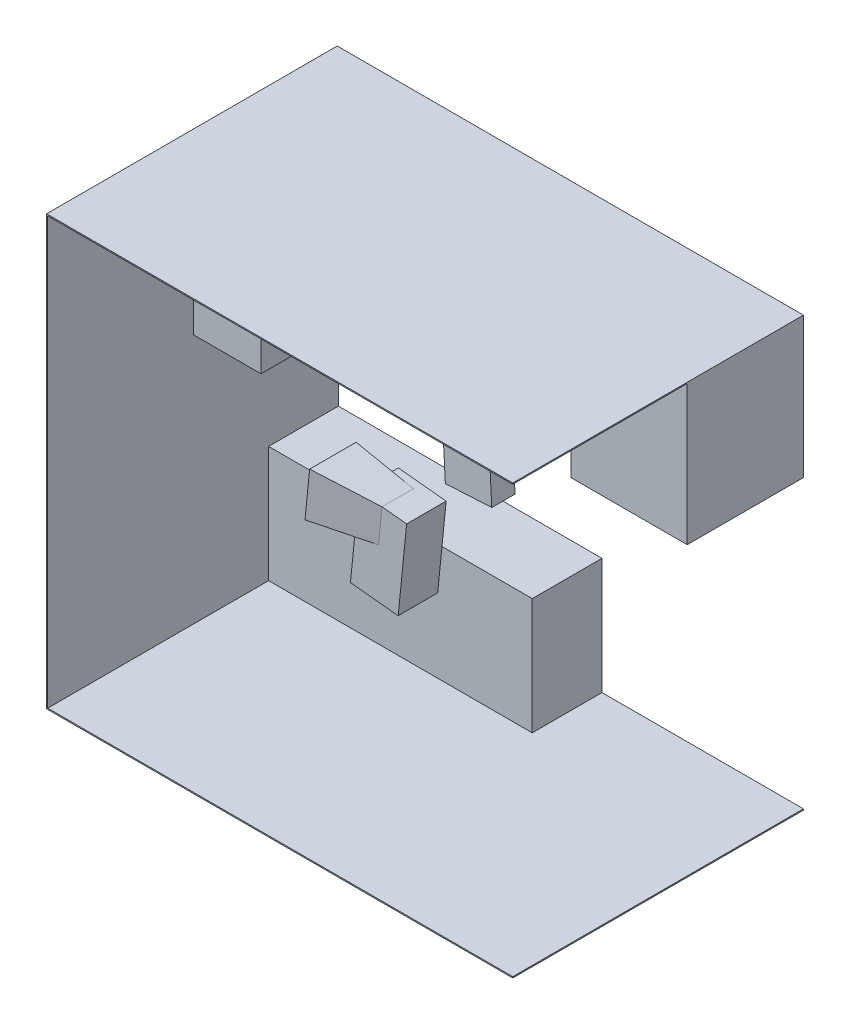
ISO-10303-21;
HEADER;
FILE_DESCRIPTION(('STEP AP214'),'2;1');
FILE_NAME('part.step','',(''),(''),'','','');
FILE_SCHEMA(('AUTOMOTIVE_DESIGN { 1 0 10303 214 1 1 1 1 }'));
ENDSEC;
DATA;
#1=APPLICATION_CONTEXT('core data for automotive mechanical design processes');
#2=APPLICATION_PROTOCOL_DEFINITION('international standard','automotive_design',2000,#1);
#3=PRODUCT_CONTEXT('',#1,'mechanical');
#4=PRODUCT('Part','Part','',(#3));
#5=PRODUCT_RELATED_PRODUCT_CATEGORY('part','',(#4));
#6=PRODUCT_DEFINITION_FORMATION('','',#4);
#7=PRODUCT_DEFINITION_CONTEXT('part definition',#1,'design');
#8=PRODUCT_DEFINITION('design','',#6,#7);
#9=PRODUCT_DEFINITION_SHAPE('','',#8);
#10=(LENGTH_UNIT() NAMED_UNIT(*) SI_UNIT(.MILLI.,.METRE.));
#11=(NAMED_UNIT(*) PLANE_ANGLE_UNIT() SI_UNIT($,.RADIAN.));
#12=(NAMED_UNIT(*) SI_UNIT($,.STERADIAN.) SOLID_ANGLE_UNIT());
#13=UNCERTAINTY_MEASURE_WITH_UNIT(LENGTH_MEASURE(1.E-05),#10,'distance_accuracy_value','');
#14=(GEOMETRIC_REPRESENTATION_CONTEXT(3) GLOBAL_UNCERTAINTY_ASSIGNED_CONTEXT((#13)) GLOBAL_UNIT_ASSIGNED_CONTEXT((#10,
#11,#12)) REPRESENTATION_CONTEXT('',''));
#15=CARTESIAN_POINT('',(0.,0.,0.));
#16=DIRECTION('',(0.,0.,1.));
#17=DIRECTION('',(1.,0.,0.));
#18=AXIS2_PLACEMENT_3D('',#15,#16,#17);
#19=CARTESIAN_POINT('',(1132.48794205898,-728.803884791874,683.9));
#20=DIRECTION('',(-0.100393471643706,-0.994947813129575,0.));
#21=DIRECTION('',(0.994947813129576,-0.100393471643706,0.));
#22=AXIS2_PLACEMENT_3D('',#19,#20,#21);
#23=PLANE('',#22);
#24=DIRECTION('',(0.,0.,1.));
#25=VECTOR('',#24,1.);
#26=CARTESIAN_POINT('',(1543.15265192821,-770.241290212813,683.9));
#27=LINE('',#26,#25);
#28=CARTESIAN_POINT('',(1543.15265192821,-770.241290212813,683.9));
#29=VERTEX_POINT('',#28);
#30=CARTESIAN_POINT('',(1543.15265192821,-770.241290212813,1023.9));
#31=VERTEX_POINT('',#30);
#32=EDGE_CURVE('E398',#29,#31,#27,.T.);
#33=ORIENTED_EDGE('',*,*,#32,.T.);
#34=DIRECTION('',(-0.994947813129576,0.100393471643706,0.));
#35=VECTOR('',#34,1.);
#36=CARTESIAN_POINT('',(-61.3833228855726,-608.338389615358,1023.9));
#37=LINE('',#36,#35);
#38=CARTESIAN_POINT('',(1132.48794205898,-728.803884791874,1023.9));
#39=VERTEX_POINT('',#38);
#40=EDGE_CURVE('E377',#31,#39,#37,.T.);
#41=ORIENTED_EDGE('',*,*,#40,.T.);
#42=DIRECTION('',(0.,0.,1.));
#43=VECTOR('',#42,1.);
#44=CARTESIAN_POINT('',(1132.48794205898,-728.803884791874,683.9));
#45=LINE('',#44,#43);
#46=CARTESIAN_POINT('',(1132.48794205898,-728.803884791874,683.9));
#47=VERTEX_POINT('',#46);
#48=EDGE_CURVE('E183',#47,#39,#45,.T.);
#49=ORIENTED_EDGE('',*,*,#48,.F.);
#50=DIRECTION('',(0.994947813129575,-0.100393471643706,0.));
#51=VECTOR('',#50,1.);
#52=CARTESIAN_POINT('',(1132.48794205898,-728.803884791874,683.9));
#53=LINE('',#52,#51);
#54=EDGE_CURVE('E387',#47,#29,#53,.T.);
#55=ORIENTED_EDGE('',*,*,#54,.T.);
#56=EDGE_LOOP('',(#33,#41,#49,#55));
#57=FACE_BOUND('',#56,.T.);
#58=ADVANCED_FACE('F173',(#57),#23,.T.);
#59=CARTESIAN_POINT('',(1132.48794205898,-728.803884791874,683.9));
#60=DIRECTION('',(0.994947813129575,-0.100393471643706,0.));
#61=DIRECTION('',(0.100393471643706,0.994947813129576,0.));
#62=AXIS2_PLACEMENT_3D('',#59,#60,#61);
#63=PLANE('',#62);
#64=DIRECTION('',(0.,0.,-1.));
#65=VECTOR('',#64,1.);
#66=CARTESIAN_POINT('',(1173.03686525587,-326.944463068838,683.9));
#67=LINE('',#66,#65);
#68=CARTESIAN_POINT('',(1173.03686525587,-326.944463068838,1023.9));
#69=VERTEX_POINT('',#68);
#70=CARTESIAN_POINT('',(1173.03686525587,-326.944463068838,753.9));
#71=VERTEX_POINT('',#70);
#72=EDGE_CURVE('E277',#69,#71,#67,.T.);
#73=ORIENTED_EDGE('',*,*,#72,.T.);
#74=DIRECTION('',(0.100393471643706,0.994947813129576,0.));
#75=VECTOR('',#74,1.);
#76=CARTESIAN_POINT('',(1193.87126494455,-120.465495176516,753.9));
#77=LINE('',#76,#75);
#78=CARTESIAN_POINT('',(1205.16277618186,-8.56116286737377,753.9));
#79=VERTEX_POINT('',#78);
#80=EDGE_CURVE('E191',#71,#79,#77,.T.);
#81=ORIENTED_EDGE('',*,*,#80,.T.);
#82=DIRECTION('',(0.,0.,1.));
#83=VECTOR('',#82,1.);
#84=CARTESIAN_POINT('',(1205.16277618186,-8.5611628673738,683.9));
#85=LINE('',#84,#83);
#86=CARTESIAN_POINT('',(1205.16277618186,-8.5611628673738,683.9));
#87=VERTEX_POINT('',#86);
#88=EDGE_CURVE('E400',#87,#79,#85,.T.);
#89=ORIENTED_EDGE('',*,*,#88,.F.);
#90=DIRECTION('',(0.100393471643706,0.994947813129575,0.));
#91=VECTOR('',#90,1.);
#92=CARTESIAN_POINT('',(1132.48794205898,-728.803884791874,683.9));
#93=LINE('',#92,#91);
#94=EDGE_CURVE('E396',#47,#87,#93,.T.);
#95=ORIENTED_EDGE('',*,*,#94,.F.);
#96=ORIENTED_EDGE('',*,*,#48,.T.);
#97=DIRECTION('',(-0.100393471643706,-0.994947813129576,0.));
#98=VECTOR('',#97,1.);
#99=CARTESIAN_POINT('',(1193.87126494455,-120.465495176516,1023.9));
#100=LINE('',#99,#98);
#101=EDGE_CURVE('E373',#69,#39,#100,.T.);
#102=ORIENTED_EDGE('',*,*,#101,.F.);
#103=EDGE_LOOP('',(#73,#81,#89,#95,#96,#102));
#104=FACE_BOUND('',#103,.T.);
#105=ADVANCED_FACE('F370',(#104),#63,.F.);
#106=CARTESIAN_POINT('',(1205.16277618186,-8.5611628673738,683.9));
#107=DIRECTION('',(-0.100393471643706,-0.994947813129575,0.));
#108=DIRECTION('',(0.994947813129575,-0.100393471643706,0.));
#109=AXIS2_PLACEMENT_3D('',#106,#107,#108);
#110=PLANE('',#109);
#111=DIRECTION('',(-0.994947813129575,0.100393471643706,0.));
#112=VECTOR('',#111,1.);
#113=CARTESIAN_POINT('',(11.2915112373061,111.904332309142,1023.9));
#114=LINE('',#113,#112);
#115=CARTESIAN_POINT('',(1615.82748605109,-49.9985682883134,1023.9));
#116=VERTEX_POINT('',#115);
#117=CARTESIAN_POINT('',(1404.15233880777,-28.6398571961158,1023.9));
#118=VERTEX_POINT('',#117);
#119=EDGE_CURVE('E385',#116,#118,#114,.T.);
#120=ORIENTED_EDGE('',*,*,#119,.F.);
#121=DIRECTION('',(0.,0.,1.));
#122=VECTOR('',#121,1.);
#123=CARTESIAN_POINT('',(1615.82748605109,-49.9985682883134,683.9));
#124=LINE('',#123,#122);
#125=CARTESIAN_POINT('',(1615.82748605109,-49.9985682883134,683.9));
#126=VERTEX_POINT('',#125);
#127=EDGE_CURVE('E402',#126,#116,#124,.T.);
#128=ORIENTED_EDGE('',*,*,#127,.F.);
#129=DIRECTION('',(0.994947813129575,-0.100393471643706,0.));
#130=VECTOR('',#129,1.);
#131=CARTESIAN_POINT('',(1205.16277618186,-8.5611628673738,683.9));
#132=LINE('',#131,#130);
#133=EDGE_CURVE('E394',#87,#126,#132,.T.);
#134=ORIENTED_EDGE('',*,*,#133,.F.);
#135=ORIENTED_EDGE('',*,*,#88,.T.);
#136=DIRECTION('',(-0.994947813129575,0.10039347164371,0.));
#137=VECTOR('',#136,1.);
#138=CARTESIAN_POINT('',(11.291511237307,111.904332309147,753.9));
#139=LINE('',#138,#137);
#140=CARTESIAN_POINT('',(1404.15233880777,-28.6398571961158,753.9));
#141=VERTEX_POINT('',#140);
#142=EDGE_CURVE('E388',#141,#79,#139,.T.);
#143=ORIENTED_EDGE('',*,*,#142,.F.);
#144=CARTESIAN_POINT('',(1404.15233880777,-28.6398571961158,1023.9));
#145=DIRECTION('',(0.,0.,-1.));
#146=VECTOR('',#145,1.);
#147=LINE('',#144,#146);
#148=EDGE_CURVE('E275',#118,#141,#147,.T.);
#149=ORIENTED_EDGE('',*,*,#148,.F.);
#150=EDGE_LOOP('',(#120,#128,#134,#135,#143,#149));
#151=FACE_BOUND('',#150,.T.);
#152=ADVANCED_FACE('F418',(#151),#110,.F.);
#153=CARTESIAN_POINT('',(1543.15265192821,-770.241290212813,683.9));
#154=DIRECTION('',(0.994947813129575,-0.100393471643706,0.));
#155=DIRECTION('',(0.100393471643706,0.994947813129576,0.));
#156=AXIS2_PLACEMENT_3D('',#153,#154,#155);
#157=PLANE('',#156);
#158=ORIENTED_EDGE('',*,*,#127,.T.);
#159=DIRECTION('',(-0.100393471643706,-0.994947813129576,0.));
#160=VECTOR('',#159,1.);
#161=CARTESIAN_POINT('',(1604.53597481378,-161.902900597455,1023.9));
#162=LINE('',#161,#160);
#163=EDGE_CURVE('E379',#116,#31,#162,.T.);
#164=ORIENTED_EDGE('',*,*,#163,.T.);
#165=ORIENTED_EDGE('',*,*,#32,.F.);
#166=DIRECTION('',(0.100393471643706,0.994947813129575,0.));
#167=VECTOR('',#166,1.);
#168=CARTESIAN_POINT('',(1543.15265192821,-770.241290212813,683.9));
#169=LINE('',#168,#167);
#170=EDGE_CURVE('E391',#29,#126,#169,.T.);
#171=ORIENTED_EDGE('',*,*,#170,.T.);
#172=EDGE_LOOP('',(#158,#164,#165,#171));
#173=FACE_BOUND('',#172,.T.);
#174=ADVANCED_FACE('F463',(#173),#157,.T.);
#175=CARTESIAN_POINT('',(0.,0.,683.9));
#176=DIRECTION('',(0.,0.,1.));
#177=DIRECTION('',(1.,0.,0.));
#178=AXIS2_PLACEMENT_3D('',#175,#176,#177);
#179=PLANE('',#178);
#180=ORIENTED_EDGE('',*,*,#54,.F.);
#181=ORIENTED_EDGE('',*,*,#94,.T.);
#182=ORIENTED_EDGE('',*,*,#133,.T.);
#183=ORIENTED_EDGE('',*,*,#170,.F.);
#184=EDGE_LOOP('',(#180,#181,#182,#183));
#185=FACE_BOUND('',#184,.T.);
#186=ADVANCED_FACE('F460',(#185),#179,.F.);
#187=CARTESIAN_POINT('',(0.,0.,1023.9));
#188=DIRECTION('',(0.,0.,-1.));
#189=DIRECTION('',(-1.,0.,0.));
#190=AXIS2_PLACEMENT_3D('',#187,#188,#189);
#191=PLANE('',#190);
#192=CARTESIAN_POINT('',(1374.03429731466,-327.124201134988,1023.9));
#193=DIRECTION('',(0.100393471643707,0.994947813129575,0.));
#194=VECTOR('',#193,1.);
#195=LINE('',#192,#194);
#196=CARTESIAN_POINT('',(1374.03429731466,-327.124201134988,1023.9));
#197=VERTEX_POINT('',#196);
#198=EDGE_CURVE('E279',#197,#118,#195,.T.);
#199=ORIENTED_EDGE('',*,*,#198,.F.);
#200=DIRECTION('',(-0.999999600176004,0.000894230301576734,0.));
#201=VECTOR('',#200,1.);
#202=CARTESIAN_POINT('',(-0.291425512528428,-325.89523693803,1023.9));
#203=LINE('',#202,#201);
#204=EDGE_CURVE('E14',#197,#69,#203,.T.);
#205=ORIENTED_EDGE('',*,*,#204,.T.);
#206=ORIENTED_EDGE('',*,*,#101,.T.);
#207=ORIENTED_EDGE('',*,*,#40,.F.);
#208=ORIENTED_EDGE('',*,*,#163,.F.);
#209=ORIENTED_EDGE('',*,*,#119,.T.);
#210=EDGE_LOOP('',(#199,#205,#206,#207,#208,#209));
#211=FACE_BOUND('',#210,.T.);
#212=ADVANCED_FACE('F441',(#211),#191,.F.);
#213=CARTESIAN_POINT('',(871.54071716768,-326.674855969613,753.9));
#214=DIRECTION('',(0.,0.,-1.));
#215=DIRECTION('',(0.100393471643707,0.994947813129575,0.));
#216=AXIS2_PLACEMENT_3D('',#213,#214,#215);
#217=PLANE('',#216);
#218=ORIENTED_EDGE('',*,*,#80,.F.);
#219=CARTESIAN_POINT('',(871.54071716768,-326.674855969613,753.9));
#220=CARTESIAN_POINT('',(1039.03857721667,-326.824637691405,753.9));
#221=CARTESIAN_POINT('',(1206.53643726567,-326.974419413196,753.9));
#222=CARTESIAN_POINT('',(1374.03429731466,-327.124201134988,753.9));
#223=B_SPLINE_CURVE_WITH_KNOTS('',3,(#219,#220,#221,#222),.UNSPECIFIED.,.F.,.F.,(4,4),(0.,1.),.UNSPECIFIED.);
#224=CARTESIAN_POINT('',(871.54071716768,-326.674855969613,753.9));
#225=VERTEX_POINT('',#224);
#226=EDGE_CURVE('E267',#225,#71,#223,.T.);
#227=ORIENTED_EDGE('',*,*,#226,.F.);
#228=DIRECTION('',(-0.100393471643707,-0.994947813129575,0.));
#229=VECTOR('',#228,1.);
#230=CARTESIAN_POINT('',(911.698105825163,71.3042692822166,753.9));
#231=LINE('',#230,#229);
#232=CARTESIAN_POINT('',(911.698105825163,71.3042692822166,753.9));
#233=VERTEX_POINT('',#232);
#234=EDGE_CURVE('E250',#233,#225,#231,.T.);
#235=ORIENTED_EDGE('',*,*,#234,.F.);
#236=CARTESIAN_POINT('',(911.698105825163,71.3042692822166,753.9));
#237=CARTESIAN_POINT('',(1075.84951681937,37.9895604561058,753.9));
#238=CARTESIAN_POINT('',(1240.00092781357,4.67485162999499,753.9));
#239=CARTESIAN_POINT('',(1404.15233880777,-28.6398571961158,753.9));
#240=B_SPLINE_CURVE_WITH_KNOTS('',3,(#236,#237,#238,#239),.UNSPECIFIED.,.F.,.F.,(4,4),(0.,1.),.UNSPECIFIED.);
#241=EDGE_CURVE('E265',#233,#141,#240,.T.);
#242=ORIENTED_EDGE('',*,*,#241,.T.);
#243=ORIENTED_EDGE('',*,*,#142,.T.);
#244=EDGE_LOOP('',(#218,#227,#235,#242,#243));
#245=FACE_BOUND('',#244,.T.);
#246=ADVANCED_FACE('F264',(#245),#217,.T.);
#247=CARTESIAN_POINT('',(871.54071716768,-326.674855969614,1153.9));
#248=DIRECTION('',(-0.000894230301576733,-0.999999600176004,0.));
#249=DIRECTION('',(0.,0.,-1.));
#250=AXIS2_PLACEMENT_3D('',#247,#248,#249);
#251=PLANE('',#250);
#252=ORIENTED_EDGE('',*,*,#72,.F.);
#253=ORIENTED_EDGE('',*,*,#204,.F.);
#254=CARTESIAN_POINT('',(871.54071716768,-326.674855969614,1153.9));
#255=CARTESIAN_POINT('',(1039.03857721667,-326.824637691405,1110.56666666667));
#256=CARTESIAN_POINT('',(1206.53643726567,-326.974419413196,1067.23333333333));
#257=CARTESIAN_POINT('',(1374.03429731466,-327.124201134988,1023.9));
#258=B_SPLINE_CURVE_WITH_KNOTS('',3,(#254,#255,#256,#257),.UNSPECIFIED.,.F.,.F.,(4,4),(0.,1.),.UNSPECIFIED.);
#259=CARTESIAN_POINT('',(871.54071716768,-326.674855969614,1153.9));
#260=VERTEX_POINT('',#259);
#261=EDGE_CURVE('E281',#260,#197,#258,.T.);
#262=ORIENTED_EDGE('',*,*,#261,.F.);
#263=DIRECTION('',(0.,0.,1.));
#264=VECTOR('',#263,1.);
#265=CARTESIAN_POINT('',(871.54071716768,-326.674855969613,753.9));
#266=LINE('',#265,#264);
#267=EDGE_CURVE('E268',#225,#260,#266,.T.);
#268=ORIENTED_EDGE('',*,*,#267,.F.);
#269=ORIENTED_EDGE('',*,*,#226,.T.);
#270=EDGE_LOOP('',(#252,#253,#262,#268,#269));
#271=FACE_BOUND('',#270,.T.);
#272=ADVANCED_FACE('F334',(#271),#251,.T.);
#273=CARTESIAN_POINT('',(895.386921005672,-90.3474536834046,7.2048292591265E-13));
#274=DIRECTION('',(-0.994947813129575,0.100393471643707,0.));
#275=DIRECTION('',(-0.100393471643707,-0.994947813129575,0.));
#276=AXIS2_PLACEMENT_3D('',#273,#274,#275);
#277=PLANE('',#276);
#278=ORIENTED_EDGE('',*,*,#234,.T.);
#279=ORIENTED_EDGE('',*,*,#267,.T.);
#280=DIRECTION('',(-0.100393471643708,-0.994947813129575,0.));
#281=VECTOR('',#280,1.);
#282=CARTESIAN_POINT('',(911.698105825163,71.3042692822167,1153.9));
#283=LINE('',#282,#281);
#284=CARTESIAN_POINT('',(911.698105825163,71.3042692822167,1153.9));
#285=VERTEX_POINT('',#284);
#286=EDGE_CURVE('E252',#285,#260,#283,.T.);
#287=ORIENTED_EDGE('',*,*,#286,.F.);
#288=DIRECTION('',(0.,0.,1.));
#289=VECTOR('',#288,1.);
#290=CARTESIAN_POINT('',(911.698105825163,71.3042692822166,753.9));
#291=LINE('',#290,#289);
#292=EDGE_CURVE('E245',#233,#285,#291,.T.);
#293=ORIENTED_EDGE('',*,*,#292,.F.);
#294=EDGE_LOOP('',(#278,#279,#287,#293));
#295=FACE_BOUND('',#294,.T.);
#296=ADVANCED_FACE('F248',(#295),#277,.T.);
#297=CARTESIAN_POINT('',(911.698105825163,71.3042692822167,1153.9));
#298=DIRECTION('',(0.250362550522907,-0.0252623959617625,0.967822506788273));
#299=DIRECTION('',(-0.100393471643708,-0.994947813129575,0.));
#300=AXIS2_PLACEMENT_3D('',#297,#298,#299);
#301=PLANE('',#300);
#302=ORIENTED_EDGE('',*,*,#286,.T.);
#303=ORIENTED_EDGE('',*,*,#261,.T.);
#304=ORIENTED_EDGE('',*,*,#198,.T.);
#305=CARTESIAN_POINT('',(911.698105825163,71.3042692822167,1153.9));
#306=CARTESIAN_POINT('',(1075.84951681937,37.9895604561058,1110.56666666667));
#307=CARTESIAN_POINT('',(1240.00092781357,4.67485162999501,1067.23333333333));
#308=CARTESIAN_POINT('',(1404.15233880777,-28.6398571961158,1023.9));
#309=B_SPLINE_CURVE_WITH_KNOTS('',3,(#305,#306,#307,#308),.UNSPECIFIED.,.F.,.F.,(4,4),(0.,1.),.UNSPECIFIED.);
#310=EDGE_CURVE('E258',#285,#118,#309,.T.);
#311=ORIENTED_EDGE('',*,*,#310,.F.);
#312=EDGE_LOOP('',(#302,#303,#304,#311));
#313=FACE_BOUND('',#312,.T.);
#314=ADVANCED_FACE('F333',(#313),#301,.T.);
#315=CARTESIAN_POINT('',(911.698105825163,71.3042692822166,753.9));
#316=DIRECTION('',(0.198896245577981,0.980020552588048,0.));
#317=DIRECTION('',(0.,0.,1.));
#318=AXIS2_PLACEMENT_3D('',#315,#316,#317);
#319=PLANE('',#318);
#320=ORIENTED_EDGE('',*,*,#292,.T.);
#321=ORIENTED_EDGE('',*,*,#310,.T.);
#322=ORIENTED_EDGE('',*,*,#148,.T.);
#323=ORIENTED_EDGE('',*,*,#241,.F.);
#324=EDGE_LOOP('',(#320,#321,#322,#323));
#325=FACE_BOUND('',#324,.T.);
#326=ADVANCED_FACE('F273',(#325),#319,.T.);
#327=CLOSED_SHELL('',(#58,#105,#152,#174,#186,#212,#246,#272,#296,#314,#326));
#328=MANIFOLD_SOLID_BREP('B2',#327);
#329=CARTESIAN_POINT('',(1099.95205544481,59.3412734896966,200.));
#330=DIRECTION('',(-0.998547923582389,-0.0538706256627785,0.));
#331=DIRECTION('',(0.0538706256627785,-0.998547923582389,0.));
#332=AXIS2_PLACEMENT_3D('',#329,#330,#331);
#333=PLANE('',#332);
#334=DIRECTION('',(-0.0538706256627785,0.998547923582389,0.));
#335=VECTOR('',#334,1.);
#336=CARTESIAN_POINT('',(1099.95205544481,59.3412734896966,0.));
#337=LINE('',#336,#335);
#338=CARTESIAN_POINT('',(1125.11888205404,-407.151961823966,0.));
#339=VERTEX_POINT('',#338);
#340=CARTESIAN_POINT('',(1074.31888205404,534.478730114227,0.));
#341=VERTEX_POINT('',#340);
#342=EDGE_CURVE('E673',#339,#341,#337,.T.);
#343=ORIENTED_EDGE('',*,*,#342,.F.);
#344=DIRECTION('',(0.,0.,-1.));
#345=VECTOR('',#344,1.);
#346=CARTESIAN_POINT('',(1125.11888205404,-407.151961823966,200.));
#347=LINE('',#346,#345);
#348=CARTESIAN_POINT('',(1125.11888205404,-407.151961823966,200.));
#349=VERTEX_POINT('',#348);
#350=EDGE_CURVE('E171',#349,#339,#347,.T.);
#351=ORIENTED_EDGE('',*,*,#350,.F.);
#352=DIRECTION('',(-0.0538706256627785,0.998547923582389,0.));
#353=VECTOR('',#352,1.);
#354=CARTESIAN_POINT('',(1099.95205544481,59.3412734896966,200.));
#355=LINE('',#354,#353);
#356=CARTESIAN_POINT('',(1074.31888205404,534.478730114227,200.));
#357=VERTEX_POINT('',#356);
#358=EDGE_CURVE('E658',#349,#357,#355,.T.);
#359=ORIENTED_EDGE('',*,*,#358,.T.);
#360=DIRECTION('',(0.,0.,-1.));
#361=VECTOR('',#360,1.);
#362=CARTESIAN_POINT('',(1074.31888205404,534.478730114227,200.));
#363=LINE('',#362,#361);
#364=EDGE_CURVE('E626',#357,#341,#363,.T.);
#365=ORIENTED_EDGE('',*,*,#364,.T.);
#366=EDGE_LOOP('',(#343,#351,#359,#365));
#367=FACE_BOUND('',#366,.T.);
#368=ADVANCED_FACE('F610',(#367),#333,.T.);
#369=CARTESIAN_POINT('',(25.1668266092262,-466.493235313663,200.));
#370=DIRECTION('',(-0.0538706256627786,0.998547923582389,0.));
#371=DIRECTION('',(-0.998547923582389,-0.0538706256627786,0.));
#372=AXIS2_PLACEMENT_3D('',#369,#370,#371);
#373=PLANE('',#372);
#374=DIRECTION('',(0.998547923582389,0.0538706256627786,0.));
#375=VECTOR('',#374,1.);
#376=CARTESIAN_POINT('',(25.1668266092262,-466.493235313663,0.));
#377=LINE('',#376,#375);
#378=CARTESIAN_POINT('',(1524.53805148699,-385.603711558855,0.));
#379=VERTEX_POINT('',#378);
#380=EDGE_CURVE('E664',#339,#379,#377,.T.);
#381=ORIENTED_EDGE('',*,*,#380,.T.);
#382=DIRECTION('',(0.,0.,-1.));
#383=VECTOR('',#382,1.);
#384=CARTESIAN_POINT('',(1524.53805148699,-385.603711558855,200.));
#385=LINE('',#384,#383);
#386=CARTESIAN_POINT('',(1524.53805148699,-385.603711558855,200.));
#387=VERTEX_POINT('',#386);
#388=EDGE_CURVE('E618',#387,#379,#385,.T.);
#389=ORIENTED_EDGE('',*,*,#388,.F.);
#390=DIRECTION('',(0.998547923582389,0.0538706256627786,0.));
#391=VECTOR('',#390,1.);
#392=CARTESIAN_POINT('',(25.1668266092262,-466.493235313663,200.));
#393=LINE('',#392,#391);
#394=EDGE_CURVE('E652',#349,#387,#393,.T.);
#395=ORIENTED_EDGE('',*,*,#394,.F.);
#396=ORIENTED_EDGE('',*,*,#350,.T.);
#397=EDGE_LOOP('',(#381,#389,#395,#396));
#398=FACE_BOUND('',#397,.T.);
#399=ADVANCED_FACE('F662',(#398),#373,.F.);
#400=CARTESIAN_POINT('',(1499.37122487777,80.889523754808,200.));
#401=DIRECTION('',(-0.998547923582389,-0.0538706256627786,0.));
#402=DIRECTION('',(0.0538706256627786,-0.998547923582389,0.));
#403=AXIS2_PLACEMENT_3D('',#400,#401,#402);
#404=PLANE('',#403);
#405=DIRECTION('',(-0.0538706256627785,0.998547923582389,0.));
#406=VECTOR('',#405,1.);
#407=CARTESIAN_POINT('',(1499.37122487777,80.889523754808,0.));
#408=LINE('',#407,#406);
#409=CARTESIAN_POINT('',(1473.73805148699,556.026980379339,0.));
#410=VERTEX_POINT('',#409);
#411=EDGE_CURVE('E676',#379,#410,#408,.T.);
#412=ORIENTED_EDGE('',*,*,#411,.T.);
#413=DIRECTION('',(0.,0.,-1.));
#414=VECTOR('',#413,1.);
#415=CARTESIAN_POINT('',(1473.73805148699,556.026980379339,200.));
#416=LINE('',#415,#414);
#417=CARTESIAN_POINT('',(1473.73805148699,556.026980379339,200.));
#418=VERTEX_POINT('',#417);
#419=EDGE_CURVE('E640',#418,#410,#416,.T.);
#420=ORIENTED_EDGE('',*,*,#419,.F.);
#421=DIRECTION('',(-0.0538706256627785,0.998547923582389,0.));
#422=VECTOR('',#421,1.);
#423=CARTESIAN_POINT('',(1499.37122487777,80.889523754808,200.));
#424=LINE('',#423,#422);
#425=EDGE_CURVE('E657',#387,#418,#424,.T.);
#426=ORIENTED_EDGE('',*,*,#425,.F.);
#427=ORIENTED_EDGE('',*,*,#388,.T.);
#428=EDGE_LOOP('',(#412,#420,#426,#427));
#429=FACE_BOUND('',#428,.T.);
#430=ADVANCED_FACE('F667',(#429),#404,.F.);
#431=CARTESIAN_POINT('',(-25.633173390774,475.137456624531,200.));
#432=DIRECTION('',(-0.0538706256627784,0.998547923582389,0.));
#433=DIRECTION('',(-0.998547923582389,-0.0538706256627784,0.));
#434=AXIS2_PLACEMENT_3D('',#431,#432,#433);
#435=PLANE('',#434);
#436=DIRECTION('',(0.998547923582389,0.0538706256627784,0.));
#437=VECTOR('',#436,1.);
#438=CARTESIAN_POINT('',(-25.633173390774,475.137456624531,0.));
#439=LINE('',#438,#437);
#440=EDGE_CURVE('E678',#341,#410,#439,.T.);
#441=ORIENTED_EDGE('',*,*,#440,.F.);
#442=ORIENTED_EDGE('',*,*,#364,.F.);
#443=DIRECTION('',(0.998547923582389,0.0538706256627784,0.));
#444=VECTOR('',#443,1.);
#445=CARTESIAN_POINT('',(-25.633173390774,475.137456624531,200.));
#446=LINE('',#445,#444);
#447=EDGE_CURVE('E668',#357,#418,#446,.T.);
#448=ORIENTED_EDGE('',*,*,#447,.T.);
#449=ORIENTED_EDGE('',*,*,#419,.T.);
#450=EDGE_LOOP('',(#441,#442,#448,#449));
#451=FACE_BOUND('',#450,.T.);
#452=ADVANCED_FACE('F683',(#451),#435,.T.);
#453=CARTESIAN_POINT('',(0.,0.,200.));
#454=DIRECTION('',(0.,0.,1.));
#455=DIRECTION('',(1.,0.,0.));
#456=AXIS2_PLACEMENT_3D('',#453,#454,#455);
#457=PLANE('',#456);
#458=ORIENTED_EDGE('',*,*,#358,.F.);
#459=ORIENTED_EDGE('',*,*,#394,.T.);
#460=ORIENTED_EDGE('',*,*,#425,.T.);
#461=ORIENTED_EDGE('',*,*,#447,.F.);
#462=EDGE_LOOP('',(#458,#459,#460,#461));
#463=FACE_BOUND('',#462,.T.);
#464=ADVANCED_FACE('F654',(#463),#457,.T.);
#465=CARTESIAN_POINT('',(0.,0.,0.));
#466=DIRECTION('',(0.,0.,1.));
#467=DIRECTION('',(1.,0.,0.));
#468=AXIS2_PLACEMENT_3D('',#465,#466,#467);
#469=PLANE('',#468);
#470=ORIENTED_EDGE('',*,*,#342,.T.);
#471=ORIENTED_EDGE('',*,*,#440,.T.);
#472=ORIENTED_EDGE('',*,*,#411,.F.);
#473=ORIENTED_EDGE('',*,*,#380,.F.);
#474=EDGE_LOOP('',(#470,#471,#472,#473));
#475=FACE_BOUND('',#474,.T.);
#476=ADVANCED_FACE('F690',(#475),#469,.F.);
#477=CLOSED_SHELL('',(#368,#399,#430,#452,#464,#476));
#478=MANIFOLD_SOLID_BREP('B8',#477);
#479=CARTESIAN_POINT('',(5.00000000000026,2177.6,2500.));
#480=DIRECTION('',(0.,1.,0.));
#481=DIRECTION('',(0.,0.,1.));
#482=AXIS2_PLACEMENT_3D('',#479,#480,#481);
#483=PLANE('',#482);
#484=DIRECTION('',(0.,0.,-1.));
#485=VECTOR('',#484,1.);
#486=CARTESIAN_POINT('',(3005.,2177.6,1000.));
#487=LINE('',#486,#485);
#488=CARTESIAN_POINT('',(3005.,2177.6,1000.));
#489=VERTEX_POINT('',#488);
#490=CARTESIAN_POINT('',(3005.,2177.6,0.));
#491=VERTEX_POINT('',#490);
#492=EDGE_CURVE('E889',#489,#491,#487,.T.);
#493=ORIENTED_EDGE('',*,*,#492,.F.);
#494=DIRECTION('',(1.,0.,0.));
#495=VECTOR('',#494,1.);
#496=CARTESIAN_POINT('',(0.,2177.6,1000.));
#497=LINE('',#496,#495);
#498=CARTESIAN_POINT('',(4005.,2177.6,1000.));
#499=VERTEX_POINT('',#498);
#500=EDGE_CURVE('E873',#489,#499,#497,.T.);
#501=ORIENTED_EDGE('',*,*,#500,.T.);
#502=DIRECTION('',(0.,0.,-1.));
#503=VECTOR('',#502,1.);
#504=CARTESIAN_POINT('',(4005.,2177.6,2500.));
#505=LINE('',#504,#503);
#506=CARTESIAN_POINT('',(4005.,2177.6,2500.));
#507=VERTEX_POINT('',#506);
#508=EDGE_CURVE('E886',#507,#499,#505,.T.);
#509=ORIENTED_EDGE('',*,*,#508,.F.);
#510=DIRECTION('',(1.,0.,0.));
#511=VECTOR('',#510,1.);
#512=CARTESIAN_POINT('',(5.00000000000026,2177.6,2500.));
#513=LINE('',#512,#511);
#514=CARTESIAN_POINT('',(4.99999999999944,2177.6,2500.));
#515=VERTEX_POINT('',#514);
#516=EDGE_CURVE('E902',#515,#507,#513,.T.);
#517=ORIENTED_EDGE('',*,*,#516,.F.);
#518=DIRECTION('',(0.,0.,-1.));
#519=VECTOR('',#518,1.);
#520=CARTESIAN_POINT('',(5.00000000000026,2177.6,2500.));
#521=LINE('',#520,#519);
#522=CARTESIAN_POINT('',(4.99999999999944,2177.6,0.));
#523=VERTEX_POINT('',#522);
#524=EDGE_CURVE('E763',#515,#523,#521,.T.);
#525=ORIENTED_EDGE('',*,*,#524,.T.);
#526=DIRECTION('',(1.,0.,0.));
#527=VECTOR('',#526,1.);
#528=CARTESIAN_POINT('',(5.00000000000026,2177.6,0.));
#529=LINE('',#528,#527);
#530=EDGE_CURVE('E1011',#523,#491,#529,.T.);
#531=ORIENTED_EDGE('',*,*,#530,.T.);
#532=EDGE_LOOP('',(#493,#501,#509,#517,#525,#531));
#533=FACE_BOUND('',#532,.T.);
#534=ADVANCED_FACE('F745',(#533),#483,.F.);
#535=CARTESIAN_POINT('',(5.00000000000026,-1500.,2500.));
#536=DIRECTION('',(-1.,0.,0.));
#537=DIRECTION('',(0.,-1.,0.));
#538=AXIS2_PLACEMENT_3D('',#535,#536,#537);
#539=PLANE('',#538);
#540=ORIENTED_EDGE('',*,*,#524,.F.);
#541=DIRECTION('',(0.,1.,0.));
#542=VECTOR('',#541,1.);
#543=CARTESIAN_POINT('',(5.00000000000026,-1500.,2500.));
#544=LINE('',#543,#542);
#545=CARTESIAN_POINT('',(5.00000000000026,-1490.,2500.));
#546=VERTEX_POINT('',#545);
#547=EDGE_CURVE('E988',#546,#515,#544,.T.);
#548=ORIENTED_EDGE('',*,*,#547,.F.);
#549=DIRECTION('',(0.,0.,-1.));
#550=VECTOR('',#549,1.);
#551=CARTESIAN_POINT('',(5.00000000000026,-1490.,6500.01249998047));
#552=LINE('',#551,#550);
#553=CARTESIAN_POINT('',(5.00000000000026,-1490.,600.));
#554=VERTEX_POINT('',#553);
#555=EDGE_CURVE('E966',#546,#554,#552,.T.);
#556=ORIENTED_EDGE('',*,*,#555,.T.);
#557=DIRECTION('',(0.,-1.,0.));
#558=VECTOR('',#557,1.);
#559=CARTESIAN_POINT('',(5.00000000000037,0.,600.));
#560=LINE('',#559,#558);
#561=CARTESIAN_POINT('',(5.00000000000034,-490.,600.));
#562=VERTEX_POINT('',#561);
#563=EDGE_CURVE('E941',#562,#554,#560,.T.);
#564=ORIENTED_EDGE('',*,*,#563,.F.);
#565=DIRECTION('',(0.,0.,-1.));
#566=VECTOR('',#565,1.);
#567=CARTESIAN_POINT('',(5.00000000000034,-490.,600.));
#568=LINE('',#567,#566);
#569=CARTESIAN_POINT('',(5.00000000000034,-490.,0.));
#570=VERTEX_POINT('',#569);
#571=EDGE_CURVE('E950',#562,#570,#568,.T.);
#572=ORIENTED_EDGE('',*,*,#571,.T.);
#573=DIRECTION('',(0.,1.,0.));
#574=VECTOR('',#573,1.);
#575=CARTESIAN_POINT('',(5.00000000000026,-1500.,0.));
#576=LINE('',#575,#574);
#577=CARTESIAN_POINT('',(4.99999999999978,662.730691938193,0.));
#578=VERTEX_POINT('',#577);
#579=EDGE_CURVE('E980',#570,#578,#576,.T.);
#580=ORIENTED_EDGE('',*,*,#579,.T.);
#581=DIRECTION('',(0.,0.,-1.));
#582=VECTOR('',#581,1.);
#583=CARTESIAN_POINT('',(5.00000000000026,662.730691938193,1244.6));
#584=LINE('',#583,#582);
#585=CARTESIAN_POINT('',(4.99999999999978,662.730691938193,1244.6));
#586=VERTEX_POINT('',#585);
#587=EDGE_CURVE('E919',#586,#578,#584,.T.);
#588=ORIENTED_EDGE('',*,*,#587,.F.);
#589=DIRECTION('',(0.,1.,0.));
#590=VECTOR('',#589,1.);
#591=CARTESIAN_POINT('',(5.00000000000026,0.,1244.6));
#592=LINE('',#591,#590);
#593=CARTESIAN_POINT('',(4.99999999999962,1363.13069193819,1244.6));
#594=VERTEX_POINT('',#593);
#595=EDGE_CURVE('E906',#586,#594,#592,.T.);
#596=ORIENTED_EDGE('',*,*,#595,.T.);
#597=DIRECTION('',(0.,0.,-1.));
#598=VECTOR('',#597,1.);
#599=CARTESIAN_POINT('',(5.00000000000026,1363.13069193819,1244.6));
#600=LINE('',#599,#598);
#601=CARTESIAN_POINT('',(5.00000000000026,1363.13069193819,0.));
#602=VERTEX_POINT('',#601);
#603=EDGE_CURVE('E929',#594,#602,#600,.T.);
#604=ORIENTED_EDGE('',*,*,#603,.T.);
#605=EDGE_CURVE('E749',#602,#523,#576,.T.);
#606=ORIENTED_EDGE('',*,*,#605,.T.);
#607=EDGE_LOOP('',(#540,#548,#556,#564,#572,#580,#588,#596,#604,#606));
#608=FACE_BOUND('',#607,.T.);
#609=ADVANCED_FACE('F1043',(#608),#539,.F.);
#610=CARTESIAN_POINT('',(5.00000000000026,-1500.,2500.));
#611=DIRECTION('',(0.,-1.,0.));
#612=DIRECTION('',(0.,0.,-1.));
#613=AXIS2_PLACEMENT_3D('',#610,#611,#612);
#614=PLANE('',#613);
#615=DIRECTION('',(-1.,0.,0.));
#616=VECTOR('',#615,1.);
#617=CARTESIAN_POINT('',(5.00000000000026,-1500.,0.));
#618=LINE('',#617,#616);
#619=CARTESIAN_POINT('',(4005.,-1500.,0.));
#620=VERTEX_POINT('',#619);
#621=CARTESIAN_POINT('',(-4.99999999999974,-1500.,0.));
#622=VERTEX_POINT('',#621);
#623=EDGE_CURVE('E958',#620,#622,#618,.T.);
#624=ORIENTED_EDGE('',*,*,#623,.F.);
#625=DIRECTION('',(0.,0.,-1.));
#626=VECTOR('',#625,1.);
#627=CARTESIAN_POINT('',(4005.,-1500.,6500.01249998047));
#628=LINE('',#627,#626);
#629=CARTESIAN_POINT('',(4005.,-1500.,2500.));
#630=VERTEX_POINT('',#629);
#631=EDGE_CURVE('E963',#630,#620,#628,.T.);
#632=ORIENTED_EDGE('',*,*,#631,.F.);
#633=DIRECTION('',(-1.,0.,0.));
#634=VECTOR('',#633,1.);
#635=CARTESIAN_POINT('',(5.00000000000026,-1500.,2500.));
#636=LINE('',#635,#634);
#637=CARTESIAN_POINT('',(-4.99999999999974,-1500.,2500.));
#638=VERTEX_POINT('',#637);
#639=EDGE_CURVE('E981',#630,#638,#636,.T.);
#640=ORIENTED_EDGE('',*,*,#639,.T.);
#641=DIRECTION('',(0.,0.,-1.));
#642=VECTOR('',#641,1.);
#643=CARTESIAN_POINT('',(-4.99999999999974,-1500.,2500.));
#644=LINE('',#643,#642);
#645=EDGE_CURVE('E755',#638,#622,#644,.T.);
#646=ORIENTED_EDGE('',*,*,#645,.T.);
#647=EDGE_LOOP('',(#624,#632,#640,#646));
#648=FACE_BOUND('',#647,.T.);
#649=ADVANCED_FACE('F747',(#648),#614,.T.);
#650=CARTESIAN_POINT('',(4.99999999999943,2187.6,2500.));
#651=DIRECTION('',(0.,-1.,0.));
#652=DIRECTION('',(0.,0.,-1.));
#653=AXIS2_PLACEMENT_3D('',#650,#651,#652);
#654=PLANE('',#653);
#655=DIRECTION('',(-1.,0.,0.));
#656=VECTOR('',#655,1.);
#657=CARTESIAN_POINT('',(4.99999999999943,2187.6,0.));
#658=LINE('',#657,#656);
#659=CARTESIAN_POINT('',(4005.,2187.6,0.));
#660=VERTEX_POINT('',#659);
#661=CARTESIAN_POINT('',(-4.99999999999966,2187.6,0.));
#662=VERTEX_POINT('',#661);
#663=EDGE_CURVE('E984',#660,#662,#658,.T.);
#664=ORIENTED_EDGE('',*,*,#663,.T.);
#665=DIRECTION('',(0.,0.,-1.));
#666=VECTOR('',#665,1.);
#667=CARTESIAN_POINT('',(-4.99999999999966,2187.6,2500.));
#668=LINE('',#667,#666);
#669=CARTESIAN_POINT('',(-4.99999999999966,2187.6,2500.));
#670=VERTEX_POINT('',#669);
#671=EDGE_CURVE('E608',#670,#662,#668,.T.);
#672=ORIENTED_EDGE('',*,*,#671,.F.);
#673=DIRECTION('',(-1.,0.,0.));
#674=VECTOR('',#673,1.);
#675=CARTESIAN_POINT('',(4.99999999999943,2187.6,2500.));
#676=LINE('',#675,#674);
#677=CARTESIAN_POINT('',(4005.,2187.6,2500.));
#678=VERTEX_POINT('',#677);
#679=EDGE_CURVE('E990',#678,#670,#676,.T.);
#680=ORIENTED_EDGE('',*,*,#679,.F.);
#681=DIRECTION('',(0.,0.,-1.));
#682=VECTOR('',#681,1.);
#683=CARTESIAN_POINT('',(4005.,2187.6,2500.));
#684=LINE('',#683,#682);
#685=EDGE_CURVE('E897',#678,#660,#684,.T.);
#686=ORIENTED_EDGE('',*,*,#685,.T.);
#687=EDGE_LOOP('',(#664,#672,#680,#686));
#688=FACE_BOUND('',#687,.T.);
#689=ADVANCED_FACE('F1003',(#688),#654,.F.);
#690=CARTESIAN_POINT('',(-4.99999999999974,-1500.,2500.));
#691=DIRECTION('',(-1.,0.,0.));
#692=DIRECTION('',(0.,-1.,0.));
#693=AXIS2_PLACEMENT_3D('',#690,#691,#692);
#694=PLANE('',#693);
#695=DIRECTION('',(0.,1.,0.));
#696=VECTOR('',#695,1.);
#697=CARTESIAN_POINT('',(-4.99999999999974,-1500.,0.));
#698=LINE('',#697,#696);
#699=EDGE_CURVE('E996',#622,#662,#698,.T.);
#700=ORIENTED_EDGE('',*,*,#699,.F.);
#701=ORIENTED_EDGE('',*,*,#645,.F.);
#702=DIRECTION('',(0.,1.,0.));
#703=VECTOR('',#702,1.);
#704=CARTESIAN_POINT('',(-4.99999999999974,-1500.,2500.));
#705=LINE('',#704,#703);
#706=EDGE_CURVE('E1106',#638,#670,#705,.T.);
#707=ORIENTED_EDGE('',*,*,#706,.T.);
#708=ORIENTED_EDGE('',*,*,#671,.T.);
#709=EDGE_LOOP('',(#700,#701,#707,#708));
#710=FACE_BOUND('',#709,.T.);
#711=ADVANCED_FACE('F1087',(#710),#694,.T.);
#712=CARTESIAN_POINT('',(0.,0.,2500.));
#713=DIRECTION('',(0.,0.,-1.));
#714=DIRECTION('',(-1.,0.,0.));
#715=AXIS2_PLACEMENT_3D('',#712,#713,#714);
#716=PLANE('',#715);
#717=ORIENTED_EDGE('',*,*,#639,.F.);
#718=DIRECTION('',(0.,1.,0.));
#719=VECTOR('',#718,1.);
#720=CARTESIAN_POINT('',(4005.,0.,2500.));
#721=LINE('',#720,#719);
#722=CARTESIAN_POINT('',(4005.,-1490.,2500.));
#723=VERTEX_POINT('',#722);
#724=EDGE_CURVE('E956',#630,#723,#721,.T.);
#725=ORIENTED_EDGE('',*,*,#724,.T.);
#726=DIRECTION('',(-1.,0.,0.));
#727=VECTOR('',#726,1.);
#728=CARTESIAN_POINT('',(0.,-1490.,2500.));
#729=LINE('',#728,#727);
#730=EDGE_CURVE('E959',#723,#546,#729,.T.);
#731=ORIENTED_EDGE('',*,*,#730,.T.);
#732=ORIENTED_EDGE('',*,*,#547,.T.);
#733=ORIENTED_EDGE('',*,*,#516,.T.);
#734=DIRECTION('',(0.,1.,0.));
#735=VECTOR('',#734,1.);
#736=CARTESIAN_POINT('',(4005.,2177.6,2500.));
#737=LINE('',#736,#735);
#738=EDGE_CURVE('E896',#507,#678,#737,.T.);
#739=ORIENTED_EDGE('',*,*,#738,.T.);
#740=ORIENTED_EDGE('',*,*,#679,.T.);
#741=ORIENTED_EDGE('',*,*,#706,.F.);
#742=EDGE_LOOP('',(#717,#725,#731,#732,#733,#739,#740,#741));
#743=FACE_BOUND('',#742,.T.);
#744=ADVANCED_FACE('F1084',(#743),#716,.F.);
#745=CARTESIAN_POINT('',(0.,0.,0.));
#746=DIRECTION('',(0.,0.,-1.));
#747=DIRECTION('',(-1.,0.,0.));
#748=AXIS2_PLACEMENT_3D('',#745,#746,#747);
#749=PLANE('',#748);
#750=ORIENTED_EDGE('',*,*,#579,.F.);
#751=DIRECTION('',(-1.,0.,0.));
#752=VECTOR('',#751,1.);
#753=CARTESIAN_POINT('',(0.,-490.,0.));
#754=LINE('',#753,#752);
#755=CARTESIAN_POINT('',(2272.5,-490.,0.));
#756=VERTEX_POINT('',#755);
#757=EDGE_CURVE('E939',#756,#570,#754,.T.);
#758=ORIENTED_EDGE('',*,*,#757,.F.);
#759=DIRECTION('',(0.,-1.,0.));
#760=VECTOR('',#759,1.);
#761=CARTESIAN_POINT('',(2272.5,0.,0.));
#762=LINE('',#761,#760);
#763=CARTESIAN_POINT('',(2272.5,-1490.,0.));
#764=VERTEX_POINT('',#763);
#765=EDGE_CURVE('E908',#756,#764,#762,.T.);
#766=ORIENTED_EDGE('',*,*,#765,.T.);
#767=DIRECTION('',(1.,0.,0.));
#768=VECTOR('',#767,1.);
#769=CARTESIAN_POINT('',(0.,-1490.,0.));
#770=LINE('',#769,#768);
#771=CARTESIAN_POINT('',(4005.,-1490.,0.));
#772=VERTEX_POINT('',#771);
#773=EDGE_CURVE('E962',#764,#772,#770,.T.);
#774=ORIENTED_EDGE('',*,*,#773,.T.);
#775=DIRECTION('',(0.,-1.,0.));
#776=VECTOR('',#775,1.);
#777=CARTESIAN_POINT('',(4005.,0.,0.));
#778=LINE('',#777,#776);
#779=EDGE_CURVE('E955',#772,#620,#778,.T.);
#780=ORIENTED_EDGE('',*,*,#779,.T.);
#781=ORIENTED_EDGE('',*,*,#623,.T.);
#782=ORIENTED_EDGE('',*,*,#699,.T.);
#783=ORIENTED_EDGE('',*,*,#663,.F.);
#784=DIRECTION('',(0.,1.,0.));
#785=VECTOR('',#784,1.);
#786=CARTESIAN_POINT('',(4005.,2177.6,0.));
#787=LINE('',#786,#785);
#788=CARTESIAN_POINT('',(4005.,977.6,0.));
#789=VERTEX_POINT('',#788);
#790=EDGE_CURVE('E1008',#789,#660,#787,.T.);
#791=ORIENTED_EDGE('',*,*,#790,.F.);
#792=DIRECTION('',(1.,0.,0.));
#793=VECTOR('',#792,1.);
#794=CARTESIAN_POINT('',(0.,977.6,0.));
#795=LINE('',#794,#793);
#796=CARTESIAN_POINT('',(3005.,977.6,0.));
#797=VERTEX_POINT('',#796);
#798=EDGE_CURVE('E881',#797,#789,#795,.T.);
#799=ORIENTED_EDGE('',*,*,#798,.F.);
#800=DIRECTION('',(0.,-1.,0.));
#801=VECTOR('',#800,1.);
#802=CARTESIAN_POINT('',(3005.,0.,0.));
#803=LINE('',#802,#801);
#804=EDGE_CURVE('E1020',#491,#797,#803,.T.);
#805=ORIENTED_EDGE('',*,*,#804,.F.);
#806=ORIENTED_EDGE('',*,*,#530,.F.);
#807=ORIENTED_EDGE('',*,*,#605,.F.);
#808=DIRECTION('',(1.,0.,0.));
#809=VECTOR('',#808,1.);
#810=CARTESIAN_POINT('',(5.00000000000026,1363.13069193819,0.));
#811=LINE('',#810,#809);
#812=CARTESIAN_POINT('',(583.8,1363.13069193819,0.));
#813=VERTEX_POINT('',#812);
#814=EDGE_CURVE('E914',#602,#813,#811,.T.);
#815=ORIENTED_EDGE('',*,*,#814,.T.);
#816=DIRECTION('',(0.,1.,0.));
#817=VECTOR('',#816,1.);
#818=CARTESIAN_POINT('',(583.8,662.730691938193,0.));
#819=LINE('',#818,#817);
#820=CARTESIAN_POINT('',(583.8,662.730691938193,0.));
#821=VERTEX_POINT('',#820);
#822=EDGE_CURVE('E922',#821,#813,#819,.T.);
#823=ORIENTED_EDGE('',*,*,#822,.F.);
#824=DIRECTION('',(1.,0.,0.));
#825=VECTOR('',#824,1.);
#826=CARTESIAN_POINT('',(5.00000000000026,662.730691938193,0.));
#827=LINE('',#826,#825);
#828=EDGE_CURVE('E899',#578,#821,#827,.T.);
#829=ORIENTED_EDGE('',*,*,#828,.F.);
#830=EDGE_LOOP('',(#750,#758,#766,#774,#780,#781,#782,#783,#791,#799,#805,#806,#807,#815,#823,#829));
#831=FACE_BOUND('',#830,.T.);
#832=ADVANCED_FACE('F1006',(#831),#749,.T.);
#833=CARTESIAN_POINT('',(0.,-1490.,6500.01249998047));
#834=DIRECTION('',(0.,1.,0.));
#835=DIRECTION('',(0.,0.,1.));
#836=AXIS2_PLACEMENT_3D('',#833,#834,#835);
#837=PLANE('',#836);
#838=DIRECTION('',(0.,0.,-1.));
#839=VECTOR('',#838,1.);
#840=CARTESIAN_POINT('',(2272.5,-1490.,600.));
#841=LINE('',#840,#839);
#842=CARTESIAN_POINT('',(2272.5,-1490.,600.));
#843=VERTEX_POINT('',#842);
#844=EDGE_CURVE('E945',#843,#764,#841,.T.);
#845=ORIENTED_EDGE('',*,*,#844,.F.);
#846=DIRECTION('',(1.,0.,0.));
#847=VECTOR('',#846,1.);
#848=CARTESIAN_POINT('',(0.,-1490.,600.));
#849=LINE('',#848,#847);
#850=EDGE_CURVE('E943',#554,#843,#849,.T.);
#851=ORIENTED_EDGE('',*,*,#850,.F.);
#852=ORIENTED_EDGE('',*,*,#555,.F.);
#853=ORIENTED_EDGE('',*,*,#730,.F.);
#854=DIRECTION('',(0.,0.,-1.));
#855=VECTOR('',#854,1.);
#856=CARTESIAN_POINT('',(4005.,-1490.,6500.01249998047));
#857=LINE('',#856,#855);
#858=EDGE_CURVE('E969',#723,#772,#857,.T.);
#859=ORIENTED_EDGE('',*,*,#858,.T.);
#860=ORIENTED_EDGE('',*,*,#773,.F.);
#861=EDGE_LOOP('',(#845,#851,#852,#853,#859,#860));
#862=FACE_BOUND('',#861,.T.);
#863=ADVANCED_FACE('F1077',(#862),#837,.T.);
#864=CARTESIAN_POINT('',(4005.,0.,6500.01249998047));
#865=DIRECTION('',(1.,0.,0.));
#866=DIRECTION('',(0.,0.,-1.));
#867=AXIS2_PLACEMENT_3D('',#864,#865,#866);
#868=PLANE('',#867);
#869=ORIENTED_EDGE('',*,*,#724,.F.);
#870=ORIENTED_EDGE('',*,*,#631,.T.);
#871=ORIENTED_EDGE('',*,*,#779,.F.);
#872=ORIENTED_EDGE('',*,*,#858,.F.);
#873=EDGE_LOOP('',(#869,#870,#871,#872));
#874=FACE_BOUND('',#873,.T.);
#875=ADVANCED_FACE('F1075',(#874),#868,.T.);
#876=CARTESIAN_POINT('',(2272.5,0.,600.));
#877=DIRECTION('',(1.,0.,0.));
#878=DIRECTION('',(0.,0.,-1.));
#879=AXIS2_PLACEMENT_3D('',#876,#877,#878);
#880=PLANE('',#879);
#881=ORIENTED_EDGE('',*,*,#765,.F.);
#882=DIRECTION('',(0.,0.,-1.));
#883=VECTOR('',#882,1.);
#884=CARTESIAN_POINT('',(2272.5,-490.,600.));
#885=LINE('',#884,#883);
#886=CARTESIAN_POINT('',(2272.5,-490.,600.));
#887=VERTEX_POINT('',#886);
#888=EDGE_CURVE('E953',#887,#756,#885,.T.);
#889=ORIENTED_EDGE('',*,*,#888,.F.);
#890=DIRECTION('',(0.,-1.,0.));
#891=VECTOR('',#890,1.);
#892=CARTESIAN_POINT('',(2272.5,0.,600.));
#893=LINE('',#892,#891);
#894=EDGE_CURVE('E935',#887,#843,#893,.T.);
#895=ORIENTED_EDGE('',*,*,#894,.T.);
#896=ORIENTED_EDGE('',*,*,#844,.T.);
#897=EDGE_LOOP('',(#881,#889,#895,#896));
#898=FACE_BOUND('',#897,.T.);
#899=ADVANCED_FACE('F1071',(#898),#880,.T.);
#900=CARTESIAN_POINT('',(0.,-490.,600.));
#901=DIRECTION('',(0.,-1.,0.));
#902=DIRECTION('',(1.,0.,0.));
#903=AXIS2_PLACEMENT_3D('',#900,#901,#902);
#904=PLANE('',#903);
#905=ORIENTED_EDGE('',*,*,#757,.T.);
#906=ORIENTED_EDGE('',*,*,#571,.F.);
#907=DIRECTION('',(-1.,0.,0.));
#908=VECTOR('',#907,1.);
#909=CARTESIAN_POINT('',(0.,-490.,600.));
#910=LINE('',#909,#908);
#911=EDGE_CURVE('E938',#887,#562,#910,.T.);
#912=ORIENTED_EDGE('',*,*,#911,.F.);
#913=ORIENTED_EDGE('',*,*,#888,.T.);
#914=EDGE_LOOP('',(#905,#906,#912,#913));
#915=FACE_BOUND('',#914,.T.);
#916=ADVANCED_FACE('F1067',(#915),#904,.F.);
#917=CARTESIAN_POINT('',(0.,0.,600.));
#918=DIRECTION('',(0.,0.,1.));
#919=DIRECTION('',(1.,0.,0.));
#920=AXIS2_PLACEMENT_3D('',#917,#918,#919);
#921=PLANE('',#920);
#922=ORIENTED_EDGE('',*,*,#894,.F.);
#923=ORIENTED_EDGE('',*,*,#911,.T.);
#924=ORIENTED_EDGE('',*,*,#563,.T.);
#925=ORIENTED_EDGE('',*,*,#850,.T.);
#926=EDGE_LOOP('',(#922,#923,#924,#925));
#927=FACE_BOUND('',#926,.T.);
#928=ADVANCED_FACE('F1053',(#927),#921,.T.);
#929=CARTESIAN_POINT('',(0.,0.,1244.6));
#930=DIRECTION('',(0.,0.,1.));
#931=DIRECTION('',(1.,0.,0.));
#932=AXIS2_PLACEMENT_3D('',#929,#930,#931);
#933=PLANE('',#932);
#934=ORIENTED_EDGE('',*,*,#595,.F.);
#935=DIRECTION('',(1.,0.,0.));
#936=VECTOR('',#935,1.);
#937=CARTESIAN_POINT('',(5.00000000000026,662.730691938193,1244.6));
#938=LINE('',#937,#936);
#939=CARTESIAN_POINT('',(583.8,662.730691938193,1244.6));
#940=VERTEX_POINT('',#939);
#941=EDGE_CURVE('E910',#586,#940,#938,.T.);
#942=ORIENTED_EDGE('',*,*,#941,.T.);
#943=DIRECTION('',(0.,1.,0.));
#944=VECTOR('',#943,1.);
#945=CARTESIAN_POINT('',(583.8,662.730691938193,1244.6));
#946=LINE('',#945,#944);
#947=CARTESIAN_POINT('',(583.8,1363.13069193819,1244.6));
#948=VERTEX_POINT('',#947);
#949=EDGE_CURVE('E913',#940,#948,#946,.T.);
#950=ORIENTED_EDGE('',*,*,#949,.T.);
#951=DIRECTION('',(1.,0.,0.));
#952=VECTOR('',#951,1.);
#953=CARTESIAN_POINT('',(5.00000000000026,1363.13069193819,1244.6));
#954=LINE('',#953,#952);
#955=EDGE_CURVE('E916',#594,#948,#954,.T.);
#956=ORIENTED_EDGE('',*,*,#955,.F.);
#957=EDGE_LOOP('',(#934,#942,#950,#956));
#958=FACE_BOUND('',#957,.T.);
#959=ADVANCED_FACE('F1049',(#958),#933,.T.);
#960=CARTESIAN_POINT('',(5.00000000000026,662.730691938193,1244.6));
#961=DIRECTION('',(0.,1.,0.));
#962=DIRECTION('',(0.,0.,1.));
#963=AXIS2_PLACEMENT_3D('',#960,#961,#962);
#964=PLANE('',#963);
#965=ORIENTED_EDGE('',*,*,#828,.T.);
#966=DIRECTION('',(0.,0.,-1.));
#967=VECTOR('',#966,1.);
#968=CARTESIAN_POINT('',(583.8,662.730691938193,1244.6));
#969=LINE('',#968,#967);
#970=EDGE_CURVE('E909',#940,#821,#969,.T.);
#971=ORIENTED_EDGE('',*,*,#970,.F.);
#972=ORIENTED_EDGE('',*,*,#941,.F.);
#973=ORIENTED_EDGE('',*,*,#587,.T.);
#974=EDGE_LOOP('',(#965,#971,#972,#973));
#975=FACE_BOUND('',#974,.T.);
#976=ADVANCED_FACE('F1052',(#975),#964,.F.);
#977=CARTESIAN_POINT('',(583.8,662.730691938193,1244.6));
#978=DIRECTION('',(-1.,0.,0.));
#979=DIRECTION('',(0.,0.,1.));
#980=AXIS2_PLACEMENT_3D('',#977,#978,#979);
#981=PLANE('',#980);
#982=ORIENTED_EDGE('',*,*,#822,.T.);
#983=DIRECTION('',(0.,0.,-1.));
#984=VECTOR('',#983,1.);
#985=CARTESIAN_POINT('',(583.8,1363.13069193819,1244.6));
#986=LINE('',#985,#984);
#987=EDGE_CURVE('E931',#948,#813,#986,.T.);
#988=ORIENTED_EDGE('',*,*,#987,.F.);
#989=ORIENTED_EDGE('',*,*,#949,.F.);
#990=ORIENTED_EDGE('',*,*,#970,.T.);
#991=EDGE_LOOP('',(#982,#988,#989,#990));
#992=FACE_BOUND('',#991,.T.);
#993=ADVANCED_FACE('F1057',(#992),#981,.F.);
#994=CARTESIAN_POINT('',(5.00000000000026,1363.13069193819,1244.6));
#995=DIRECTION('',(0.,1.,0.));
#996=DIRECTION('',(0.,0.,1.));
#997=AXIS2_PLACEMENT_3D('',#994,#995,#996);
#998=PLANE('',#997);
#999=ORIENTED_EDGE('',*,*,#814,.F.);
#1000=ORIENTED_EDGE('',*,*,#603,.F.);
#1001=ORIENTED_EDGE('',*,*,#955,.T.);
#1002=ORIENTED_EDGE('',*,*,#987,.T.);
#1003=EDGE_LOOP('',(#999,#1000,#1001,#1002));
#1004=FACE_BOUND('',#1003,.T.);
#1005=ADVANCED_FACE('F1039',(#1004),#998,.T.);
#1006=CARTESIAN_POINT('',(4005.,2177.6,2500.));
#1007=DIRECTION('',(-1.,0.,0.));
#1008=DIRECTION('',(0.,0.,1.));
#1009=AXIS2_PLACEMENT_3D('',#1006,#1007,#1008);
#1010=PLANE('',#1009);
#1011=ORIENTED_EDGE('',*,*,#790,.T.);
#1012=ORIENTED_EDGE('',*,*,#685,.F.);
#1013=ORIENTED_EDGE('',*,*,#738,.F.);
#1014=ORIENTED_EDGE('',*,*,#508,.T.);
#1015=DIRECTION('',(0.,-1.,0.));
#1016=VECTOR('',#1015,1.);
#1017=CARTESIAN_POINT('',(4005.,0.,1000.));
#1018=LINE('',#1017,#1016);
#1019=CARTESIAN_POINT('',(4005.,977.6,1000.));
#1020=VERTEX_POINT('',#1019);
#1021=EDGE_CURVE('E870',#499,#1020,#1018,.T.);
#1022=ORIENTED_EDGE('',*,*,#1021,.T.);
#1023=DIRECTION('',(0.,0.,-1.));
#1024=VECTOR('',#1023,1.);
#1025=CARTESIAN_POINT('',(4005.,977.6,1000.));
#1026=LINE('',#1025,#1024);
#1027=EDGE_CURVE('E1013',#1020,#789,#1026,.T.);
#1028=ORIENTED_EDGE('',*,*,#1027,.T.);
#1029=EDGE_LOOP('',(#1011,#1012,#1013,#1014,#1022,#1028));
#1030=FACE_BOUND('',#1029,.T.);
#1031=ADVANCED_FACE('F893',(#1030),#1010,.F.);
#1032=CARTESIAN_POINT('',(3005.,0.,1000.));
#1033=DIRECTION('',(1.,0.,0.));
#1034=DIRECTION('',(0.,0.,-1.));
#1035=AXIS2_PLACEMENT_3D('',#1032,#1033,#1034);
#1036=PLANE('',#1035);
#1037=ORIENTED_EDGE('',*,*,#804,.T.);
#1038=DIRECTION('',(0.,0.,-1.));
#1039=VECTOR('',#1038,1.);
#1040=CARTESIAN_POINT('',(3005.,977.6,1000.));
#1041=LINE('',#1040,#1039);
#1042=CARTESIAN_POINT('',(3005.,977.6,1000.));
#1043=VERTEX_POINT('',#1042);
#1044=EDGE_CURVE('E1015',#1043,#797,#1041,.T.);
#1045=ORIENTED_EDGE('',*,*,#1044,.F.);
#1046=DIRECTION('',(0.,-1.,0.));
#1047=VECTOR('',#1046,1.);
#1048=CARTESIAN_POINT('',(3005.,0.,1000.));
#1049=LINE('',#1048,#1047);
#1050=EDGE_CURVE('E890',#489,#1043,#1049,.T.);
#1051=ORIENTED_EDGE('',*,*,#1050,.F.);
#1052=ORIENTED_EDGE('',*,*,#492,.T.);
#1053=EDGE_LOOP('',(#1037,#1045,#1051,#1052));
#1054=FACE_BOUND('',#1053,.T.);
#1055=ADVANCED_FACE('F1030',(#1054),#1036,.F.);
#1056=CARTESIAN_POINT('',(0.,977.6,1000.));
#1057=DIRECTION('',(0.,1.,0.));
#1058=DIRECTION('',(0.,0.,1.));
#1059=AXIS2_PLACEMENT_3D('',#1056,#1057,#1058);
#1060=PLANE('',#1059);
#1061=ORIENTED_EDGE('',*,*,#798,.T.);
#1062=ORIENTED_EDGE('',*,*,#1027,.F.);
#1063=DIRECTION('',(1.,0.,0.));
#1064=VECTOR('',#1063,1.);
#1065=CARTESIAN_POINT('',(0.,977.6,1000.));
#1066=LINE('',#1065,#1064);
#1067=EDGE_CURVE('E876',#1043,#1020,#1066,.T.);
#1068=ORIENTED_EDGE('',*,*,#1067,.F.);
#1069=ORIENTED_EDGE('',*,*,#1044,.T.);
#1070=EDGE_LOOP('',(#1061,#1062,#1068,#1069));
#1071=FACE_BOUND('',#1070,.T.);
#1072=ADVANCED_FACE('F1018',(#1071),#1060,.F.);
#1073=CARTESIAN_POINT('',(0.,0.,1000.));
#1074=DIRECTION('',(0.,0.,1.));
#1075=DIRECTION('',(1.,0.,0.));
#1076=AXIS2_PLACEMENT_3D('',#1073,#1074,#1075);
#1077=PLANE('',#1076);
#1078=ORIENTED_EDGE('',*,*,#1021,.F.);
#1079=ORIENTED_EDGE('',*,*,#500,.F.);
#1080=ORIENTED_EDGE('',*,*,#1050,.T.);
#1081=ORIENTED_EDGE('',*,*,#1067,.T.);
#1082=EDGE_LOOP('',(#1078,#1079,#1080,#1081));
#1083=FACE_BOUND('',#1082,.T.);
#1084=ADVANCED_FACE('F872',(#1083),#1077,.T.);
#1085=CLOSED_SHELL('',(#534,#609,#649,#689,#711,#744,#832,#863,#875,#899,#916,#928,#959,#976,
#993,#1005,#1031,#1055,#1072,#1084));
#1086=MANIFOLD_SOLID_BREP('B165',#1085);
#1087=ADVANCED_BREP_SHAPE_REPRESENTATION('',(#18,#328,#478,#1086),#14);
#1088=SHAPE_DEFINITION_REPRESENTATION(#9,#1087);
ENDSEC;
END-ISO-10303-21;
